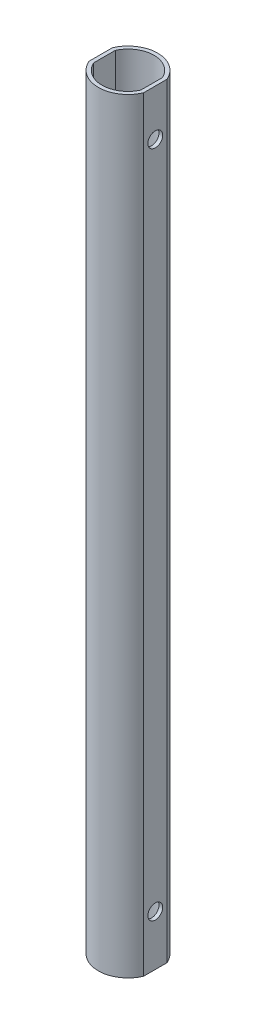
ISO-10303-21;
HEADER;
FILE_DESCRIPTION(('STEP AP214'),'2;1');
FILE_NAME('part.step','',(''),(''),'','','');
FILE_SCHEMA(('AUTOMOTIVE_DESIGN { 1 0 10303 214 1 1 1 1 }'));
ENDSEC;
DATA;
#1=APPLICATION_CONTEXT('core data for automotive mechanical design processes');
#2=APPLICATION_PROTOCOL_DEFINITION('international standard','automotive_design',2000,#1);
#3=PRODUCT_CONTEXT('',#1,'mechanical');
#4=PRODUCT('Part','Part','',(#3));
#5=PRODUCT_RELATED_PRODUCT_CATEGORY('part','',(#4));
#6=PRODUCT_DEFINITION_FORMATION('','',#4);
#7=PRODUCT_DEFINITION_CONTEXT('part definition',#1,'design');
#8=PRODUCT_DEFINITION('design','',#6,#7);
#9=PRODUCT_DEFINITION_SHAPE('','',#8);
#10=(LENGTH_UNIT() NAMED_UNIT(*) SI_UNIT(.MILLI.,.METRE.));
#11=(NAMED_UNIT(*) PLANE_ANGLE_UNIT() SI_UNIT($,.RADIAN.));
#12=(NAMED_UNIT(*) SI_UNIT($,.STERADIAN.) SOLID_ANGLE_UNIT());
#13=UNCERTAINTY_MEASURE_WITH_UNIT(LENGTH_MEASURE(1.E-05),#10,'distance_accuracy_value','');
#14=(GEOMETRIC_REPRESENTATION_CONTEXT(3) GLOBAL_UNCERTAINTY_ASSIGNED_CONTEXT((#13)) GLOBAL_UNIT_ASSIGNED_CONTEXT((#10,
#11,#12)) REPRESENTATION_CONTEXT('',''));
#15=CARTESIAN_POINT('',(0.,0.,0.));
#16=DIRECTION('',(0.,0.,1.));
#17=DIRECTION('',(1.,0.,0.));
#18=AXIS2_PLACEMENT_3D('',#15,#16,#17);
#19=CARTESIAN_POINT('',(0.,327.29,0.));
#20=DIRECTION('',(0.,1.,0.));
#21=DIRECTION('',(0.,0.,1.));
#22=AXIS2_PLACEMENT_3D('',#19,#20,#21);
#23=PLANE('',#22);
#24=CARTESIAN_POINT('',(0.,327.29,0.));
#25=DIRECTION('',(0.,1.,0.));
#26=DIRECTION('',(0.,0.,1.));
#27=AXIS2_PLACEMENT_3D('',#24,#25,#26);
#28=CIRCLE('',#27,12.7);
#29=CARTESIAN_POINT('',(-11.6743308159397,327.29,5.));
#30=VERTEX_POINT('',#29);
#31=CARTESIAN_POINT('',(11.6743308159397,327.29,5.));
#32=VERTEX_POINT('',#31);
#33=EDGE_CURVE('E142',#30,#32,#28,.T.);
#34=ORIENTED_EDGE('',*,*,#33,.T.);
#35=DIRECTION('',(0.,0.,-1.));
#36=VECTOR('',#35,1.);
#37=CARTESIAN_POINT('',(11.6743308159397,327.29,5.));
#38=LINE('',#37,#36);
#39=CARTESIAN_POINT('',(11.6743308159397,327.29,-5.));
#40=VERTEX_POINT('',#39);
#41=EDGE_CURVE('E145',#32,#40,#38,.T.);
#42=ORIENTED_EDGE('',*,*,#41,.T.);
#43=CARTESIAN_POINT('',(0.,327.29,0.));
#44=DIRECTION('',(0.,1.,0.));
#45=DIRECTION('',(0.,0.,1.));
#46=AXIS2_PLACEMENT_3D('',#43,#44,#45);
#47=CIRCLE('',#46,12.7);
#48=CARTESIAN_POINT('',(-11.6743308159397,327.29,-5.));
#49=VERTEX_POINT('',#48);
#50=EDGE_CURVE('E148',#40,#49,#47,.T.);
#51=ORIENTED_EDGE('',*,*,#50,.T.);
#52=DIRECTION('',(0.,0.,1.));
#53=VECTOR('',#52,1.);
#54=CARTESIAN_POINT('',(-11.6743308159397,327.29,-5.));
#55=LINE('',#54,#53);
#56=EDGE_CURVE('E150',#49,#30,#55,.T.);
#57=ORIENTED_EDGE('',*,*,#56,.T.);
#58=EDGE_LOOP('',(#34,#42,#51,#57));
#59=FACE_BOUND('',#58,.T.);
#60=DIRECTION('',(0.,0.,1.));
#61=VECTOR('',#60,1.);
#62=CARTESIAN_POINT('',(-10.0868308159397,327.29,-4.66299263784628));
#63=LINE('',#62,#61);
#64=CARTESIAN_POINT('',(-10.0868308159397,327.29,-4.66299263784628));
#65=VERTEX_POINT('',#64);
#66=CARTESIAN_POINT('',(-10.0868308159397,327.29,4.66299263784628));
#67=VERTEX_POINT('',#66);
#68=EDGE_CURVE('E112',#65,#67,#63,.T.);
#69=ORIENTED_EDGE('',*,*,#68,.F.);
#70=CARTESIAN_POINT('',(0.,327.29,0.));
#71=DIRECTION('',(0.,1.,0.));
#72=DIRECTION('',(0.,0.,1.));
#73=AXIS2_PLACEMENT_3D('',#70,#71,#72);
#74=CIRCLE('',#73,11.1125);
#75=CARTESIAN_POINT('',(10.0868308159397,327.29,-4.66299263784628));
#76=VERTEX_POINT('',#75);
#77=EDGE_CURVE('E104',#76,#65,#74,.T.);
#78=ORIENTED_EDGE('',*,*,#77,.F.);
#79=DIRECTION('',(0.,0.,-1.));
#80=VECTOR('',#79,1.);
#81=CARTESIAN_POINT('',(10.0868308159397,327.29,-4.66299263784628));
#82=LINE('',#81,#80);
#83=CARTESIAN_POINT('',(10.0868308159397,327.29,4.66299263784628));
#84=VERTEX_POINT('',#83);
#85=EDGE_CURVE('E126',#84,#76,#82,.T.);
#86=ORIENTED_EDGE('',*,*,#85,.F.);
#87=CARTESIAN_POINT('',(0.,327.29,0.));
#88=DIRECTION('',(0.,1.,0.));
#89=DIRECTION('',(0.,0.,1.));
#90=AXIS2_PLACEMENT_3D('',#87,#88,#89);
#91=CIRCLE('',#90,11.1125);
#92=EDGE_CURVE('E124',#67,#84,#91,.T.);
#93=ORIENTED_EDGE('',*,*,#92,.F.);
#94=EDGE_LOOP('',(#69,#78,#86,#93));
#95=FACE_BOUND('',#94,.T.);
#96=ADVANCED_FACE('F37',(#59,#95),#23,.T.);
#97=CARTESIAN_POINT('',(0.,0.,0.));
#98=DIRECTION('',(0.,1.,0.));
#99=DIRECTION('',(0.,0.,1.));
#100=AXIS2_PLACEMENT_3D('',#97,#98,#99);
#101=PLANE('',#100);
#102=CARTESIAN_POINT('',(0.,0.,0.));
#103=DIRECTION('',(0.,1.,0.));
#104=DIRECTION('',(0.,0.,1.));
#105=AXIS2_PLACEMENT_3D('',#102,#103,#104);
#106=CIRCLE('',#105,12.7);
#107=CARTESIAN_POINT('',(-11.6743308159397,0.,5.));
#108=VERTEX_POINT('',#107);
#109=CARTESIAN_POINT('',(11.6743308159397,0.,5.));
#110=VERTEX_POINT('',#109);
#111=EDGE_CURVE('E120',#108,#110,#106,.T.);
#112=ORIENTED_EDGE('',*,*,#111,.F.);
#113=DIRECTION('',(0.,0.,1.));
#114=VECTOR('',#113,1.);
#115=CARTESIAN_POINT('',(-11.6743308159397,0.,-5.));
#116=LINE('',#115,#114);
#117=CARTESIAN_POINT('',(-11.6743308159397,0.,-5.));
#118=VERTEX_POINT('',#117);
#119=EDGE_CURVE('E146',#118,#108,#116,.T.);
#120=ORIENTED_EDGE('',*,*,#119,.F.);
#121=CARTESIAN_POINT('',(0.,0.,0.));
#122=DIRECTION('',(0.,1.,0.));
#123=DIRECTION('',(0.,0.,1.));
#124=AXIS2_PLACEMENT_3D('',#121,#122,#123);
#125=CIRCLE('',#124,12.7);
#126=CARTESIAN_POINT('',(11.6743308159397,0.,-5.));
#127=VERTEX_POINT('',#126);
#128=EDGE_CURVE('E157',#127,#118,#125,.T.);
#129=ORIENTED_EDGE('',*,*,#128,.F.);
#130=DIRECTION('',(0.,0.,-1.));
#131=VECTOR('',#130,1.);
#132=CARTESIAN_POINT('',(11.6743308159397,0.,5.));
#133=LINE('',#132,#131);
#134=EDGE_CURVE('E155',#110,#127,#133,.T.);
#135=ORIENTED_EDGE('',*,*,#134,.F.);
#136=EDGE_LOOP('',(#112,#120,#129,#135));
#137=FACE_BOUND('',#136,.T.);
#138=CARTESIAN_POINT('',(0.,0.,0.));
#139=DIRECTION('',(0.,1.,0.));
#140=DIRECTION('',(0.,0.,1.));
#141=AXIS2_PLACEMENT_3D('',#138,#139,#140);
#142=CIRCLE('',#141,11.1125);
#143=CARTESIAN_POINT('',(10.0868308159397,0.,-4.66299263784628));
#144=VERTEX_POINT('',#143);
#145=CARTESIAN_POINT('',(-10.0868308159397,0.,-4.66299263784628));
#146=VERTEX_POINT('',#145);
#147=EDGE_CURVE('E62',#144,#146,#142,.T.);
#148=ORIENTED_EDGE('',*,*,#147,.T.);
#149=DIRECTION('',(0.,0.,1.));
#150=VECTOR('',#149,1.);
#151=CARTESIAN_POINT('',(-10.0868308159397,0.,-4.66299263784628));
#152=LINE('',#151,#150);
#153=CARTESIAN_POINT('',(-10.0868308159397,0.,4.66299263784628));
#154=VERTEX_POINT('',#153);
#155=EDGE_CURVE('E119',#146,#154,#152,.T.);
#156=ORIENTED_EDGE('',*,*,#155,.T.);
#157=CARTESIAN_POINT('',(0.,0.,0.));
#158=DIRECTION('',(0.,1.,0.));
#159=DIRECTION('',(0.,0.,1.));
#160=AXIS2_PLACEMENT_3D('',#157,#158,#159);
#161=CIRCLE('',#160,11.1125);
#162=CARTESIAN_POINT('',(10.0868308159397,0.,4.66299263784628));
#163=VERTEX_POINT('',#162);
#164=EDGE_CURVE('E134',#154,#163,#161,.T.);
#165=ORIENTED_EDGE('',*,*,#164,.T.);
#166=DIRECTION('',(0.,0.,-1.));
#167=VECTOR('',#166,1.);
#168=CARTESIAN_POINT('',(10.0868308159397,0.,-4.66299263784628));
#169=LINE('',#168,#167);
#170=EDGE_CURVE('E113',#163,#144,#169,.T.);
#171=ORIENTED_EDGE('',*,*,#170,.T.);
#172=EDGE_LOOP('',(#148,#156,#165,#171));
#173=FACE_BOUND('',#172,.T.);
#174=ADVANCED_FACE('F204',(#137,#173),#101,.F.);
#175=CARTESIAN_POINT('',(0.,327.29,0.));
#176=DIRECTION('',(0.,-1.,0.));
#177=DIRECTION('',(0.,0.,-1.));
#178=AXIS2_PLACEMENT_3D('',#175,#176,#177);
#179=CYLINDRICAL_SURFACE('',#178,12.7);
#180=ORIENTED_EDGE('',*,*,#111,.T.);
#181=DIRECTION('',(0.,-1.,0.));
#182=VECTOR('',#181,1.);
#183=CARTESIAN_POINT('',(11.6743308159397,327.29,5.));
#184=LINE('',#183,#182);
#185=EDGE_CURVE('E11',#32,#110,#184,.T.);
#186=ORIENTED_EDGE('',*,*,#185,.F.);
#187=ORIENTED_EDGE('',*,*,#33,.F.);
#188=DIRECTION('',(0.,-1.,0.));
#189=VECTOR('',#188,1.);
#190=CARTESIAN_POINT('',(-11.6743308159397,327.29,5.));
#191=LINE('',#190,#189);
#192=EDGE_CURVE('E152',#30,#108,#191,.T.);
#193=ORIENTED_EDGE('',*,*,#192,.T.);
#194=EDGE_LOOP('',(#180,#186,#187,#193));
#195=FACE_BOUND('',#194,.T.);
#196=ADVANCED_FACE('F39',(#195),#179,.T.);
#197=CARTESIAN_POINT('',(11.6743308159397,327.29,5.));
#198=DIRECTION('',(-1.,0.,0.));
#199=DIRECTION('',(0.,0.,1.));
#200=AXIS2_PLACEMENT_3D('',#197,#198,#199);
#201=PLANE('',#200);
#202=CARTESIAN_POINT('',(11.6743308159397,21.5,0.));
#203=DIRECTION('',(1.,0.,0.));
#204=DIRECTION('',(0.,0.,-1.));
#205=AXIS2_PLACEMENT_3D('',#202,#203,#204);
#206=CIRCLE('',#205,3.175);
#207=CARTESIAN_POINT('',(11.6743308159397,21.5,-3.175));
#208=VERTEX_POINT('',#207);
#209=EDGE_CURVE('E175',#208,#208,#206,.T.);
#210=ORIENTED_EDGE('',*,*,#209,.F.);
#211=EDGE_LOOP('',(#210));
#212=FACE_BOUND('',#211,.T.);
#213=CARTESIAN_POINT('',(11.6743308159397,307.54,0.));
#214=DIRECTION('',(1.,0.,0.));
#215=DIRECTION('',(0.,0.,-1.));
#216=AXIS2_PLACEMENT_3D('',#213,#214,#215);
#217=CIRCLE('',#216,3.175);
#218=CARTESIAN_POINT('',(11.6743308159397,307.54,-3.175));
#219=VERTEX_POINT('',#218);
#220=EDGE_CURVE('E180',#219,#219,#217,.T.);
#221=ORIENTED_EDGE('',*,*,#220,.F.);
#222=EDGE_LOOP('',(#221));
#223=FACE_BOUND('',#222,.T.);
#224=ORIENTED_EDGE('',*,*,#134,.T.);
#225=DIRECTION('',(0.,-1.,0.));
#226=VECTOR('',#225,1.);
#227=CARTESIAN_POINT('',(11.6743308159397,327.29,-5.));
#228=LINE('',#227,#226);
#229=EDGE_CURVE('E46',#40,#127,#228,.T.);
#230=ORIENTED_EDGE('',*,*,#229,.F.);
#231=ORIENTED_EDGE('',*,*,#41,.F.);
#232=ORIENTED_EDGE('',*,*,#185,.T.);
#233=EDGE_LOOP('',(#224,#230,#231,#232));
#234=FACE_BOUND('',#233,.T.);
#235=ADVANCED_FACE('F229',(#212,#223,#234),#201,.F.);
#236=CARTESIAN_POINT('',(0.,327.29,0.));
#237=DIRECTION('',(0.,-1.,0.));
#238=DIRECTION('',(0.,0.,-1.));
#239=AXIS2_PLACEMENT_3D('',#236,#237,#238);
#240=CYLINDRICAL_SURFACE('',#239,12.7);
#241=ORIENTED_EDGE('',*,*,#128,.T.);
#242=DIRECTION('',(0.,-1.,0.));
#243=VECTOR('',#242,1.);
#244=CARTESIAN_POINT('',(-11.6743308159397,327.29,-5.));
#245=LINE('',#244,#243);
#246=EDGE_CURVE('E162',#49,#118,#245,.T.);
#247=ORIENTED_EDGE('',*,*,#246,.F.);
#248=ORIENTED_EDGE('',*,*,#50,.F.);
#249=ORIENTED_EDGE('',*,*,#229,.T.);
#250=EDGE_LOOP('',(#241,#247,#248,#249));
#251=FACE_BOUND('',#250,.T.);
#252=ADVANCED_FACE('F226',(#251),#240,.T.);
#253=CARTESIAN_POINT('',(-11.6743308159397,327.29,-5.));
#254=DIRECTION('',(1.,0.,0.));
#255=DIRECTION('',(0.,0.,-1.));
#256=AXIS2_PLACEMENT_3D('',#253,#254,#255);
#257=PLANE('',#256);
#258=CARTESIAN_POINT('',(-11.6743308159397,21.5,0.));
#259=DIRECTION('',(1.,0.,0.));
#260=DIRECTION('',(0.,0.,-1.));
#261=AXIS2_PLACEMENT_3D('',#258,#259,#260);
#262=CIRCLE('',#261,3.175);
#263=CARTESIAN_POINT('',(-11.6743308159397,21.5,-3.175));
#264=VERTEX_POINT('',#263);
#265=EDGE_CURVE('E169',#264,#264,#262,.F.);
#266=ORIENTED_EDGE('',*,*,#265,.F.);
#267=EDGE_LOOP('',(#266));
#268=FACE_BOUND('',#267,.T.);
#269=CARTESIAN_POINT('',(-11.6743308159397,307.54,0.));
#270=DIRECTION('',(1.,0.,0.));
#271=DIRECTION('',(0.,0.,-1.));
#272=AXIS2_PLACEMENT_3D('',#269,#270,#271);
#273=CIRCLE('',#272,3.175);
#274=CARTESIAN_POINT('',(-11.6743308159397,307.54,-3.175));
#275=VERTEX_POINT('',#274);
#276=EDGE_CURVE('E183',#275,#275,#273,.F.);
#277=ORIENTED_EDGE('',*,*,#276,.F.);
#278=EDGE_LOOP('',(#277));
#279=FACE_BOUND('',#278,.T.);
#280=ORIENTED_EDGE('',*,*,#119,.T.);
#281=ORIENTED_EDGE('',*,*,#192,.F.);
#282=ORIENTED_EDGE('',*,*,#56,.F.);
#283=ORIENTED_EDGE('',*,*,#246,.T.);
#284=EDGE_LOOP('',(#280,#281,#282,#283));
#285=FACE_BOUND('',#284,.T.);
#286=ADVANCED_FACE('F223',(#268,#279,#285),#257,.F.);
#287=CARTESIAN_POINT('',(0.,327.29,0.));
#288=DIRECTION('',(0.,-1.,0.));
#289=DIRECTION('',(0.,0.,-1.));
#290=AXIS2_PLACEMENT_3D('',#287,#288,#289);
#291=CYLINDRICAL_SURFACE('',#290,11.1125);
#292=ORIENTED_EDGE('',*,*,#147,.F.);
#293=DIRECTION('',(0.,-1.,0.));
#294=VECTOR('',#293,1.);
#295=CARTESIAN_POINT('',(10.0868308159397,327.29,-4.66299263784628));
#296=LINE('',#295,#294);
#297=EDGE_CURVE('E108',#76,#144,#296,.T.);
#298=ORIENTED_EDGE('',*,*,#297,.F.);
#299=ORIENTED_EDGE('',*,*,#77,.T.);
#300=DIRECTION('',(0.,-1.,0.));
#301=VECTOR('',#300,1.);
#302=CARTESIAN_POINT('',(-10.0868308159397,327.29,-4.66299263784628));
#303=LINE('',#302,#301);
#304=EDGE_CURVE('E107',#65,#146,#303,.T.);
#305=ORIENTED_EDGE('',*,*,#304,.T.);
#306=EDGE_LOOP('',(#292,#298,#299,#305));
#307=FACE_BOUND('',#306,.T.);
#308=ADVANCED_FACE('F106',(#307),#291,.F.);
#309=CARTESIAN_POINT('',(-10.0868308159397,327.29,-4.66299263784628));
#310=DIRECTION('',(1.,0.,0.));
#311=DIRECTION('',(0.,0.,-1.));
#312=AXIS2_PLACEMENT_3D('',#309,#310,#311);
#313=PLANE('',#312);
#314=CARTESIAN_POINT('',(-10.0868308159397,21.5,0.));
#315=DIRECTION('',(1.,0.,0.));
#316=DIRECTION('',(0.,0.,-1.));
#317=AXIS2_PLACEMENT_3D('',#314,#315,#316);
#318=CIRCLE('',#317,3.175);
#319=CARTESIAN_POINT('',(-10.0868308159397,21.5,-3.175));
#320=VERTEX_POINT('',#319);
#321=EDGE_CURVE('E132',#320,#320,#318,.T.);
#322=ORIENTED_EDGE('',*,*,#321,.F.);
#323=EDGE_LOOP('',(#322));
#324=FACE_BOUND('',#323,.T.);
#325=CARTESIAN_POINT('',(-10.0868308159397,307.54,0.));
#326=DIRECTION('',(1.,0.,0.));
#327=DIRECTION('',(0.,0.,-1.));
#328=AXIS2_PLACEMENT_3D('',#325,#326,#327);
#329=CIRCLE('',#328,3.175);
#330=CARTESIAN_POINT('',(-10.0868308159397,307.54,-3.175));
#331=VERTEX_POINT('',#330);
#332=EDGE_CURVE('E168',#331,#331,#329,.T.);
#333=ORIENTED_EDGE('',*,*,#332,.F.);
#334=EDGE_LOOP('',(#333));
#335=FACE_BOUND('',#334,.T.);
#336=ORIENTED_EDGE('',*,*,#155,.F.);
#337=ORIENTED_EDGE('',*,*,#304,.F.);
#338=ORIENTED_EDGE('',*,*,#68,.T.);
#339=DIRECTION('',(0.,-1.,0.));
#340=VECTOR('',#339,1.);
#341=CARTESIAN_POINT('',(-10.0868308159397,327.29,4.66299263784628));
#342=LINE('',#341,#340);
#343=EDGE_CURVE('E121',#67,#154,#342,.T.);
#344=ORIENTED_EDGE('',*,*,#343,.T.);
#345=EDGE_LOOP('',(#336,#337,#338,#344));
#346=FACE_BOUND('',#345,.T.);
#347=ADVANCED_FACE('F116',(#324,#335,#346),#313,.T.);
#348=CARTESIAN_POINT('',(0.,327.29,0.));
#349=DIRECTION('',(0.,-1.,0.));
#350=DIRECTION('',(0.,0.,-1.));
#351=AXIS2_PLACEMENT_3D('',#348,#349,#350);
#352=CYLINDRICAL_SURFACE('',#351,11.1125);
#353=ORIENTED_EDGE('',*,*,#164,.F.);
#354=ORIENTED_EDGE('',*,*,#343,.F.);
#355=ORIENTED_EDGE('',*,*,#92,.T.);
#356=DIRECTION('',(0.,-1.,0.));
#357=VECTOR('',#356,1.);
#358=CARTESIAN_POINT('',(10.0868308159397,327.29,4.66299263784628));
#359=LINE('',#358,#357);
#360=EDGE_CURVE('E54',#84,#163,#359,.T.);
#361=ORIENTED_EDGE('',*,*,#360,.T.);
#362=EDGE_LOOP('',(#353,#354,#355,#361));
#363=FACE_BOUND('',#362,.T.);
#364=ADVANCED_FACE('F200',(#363),#352,.F.);
#365=CARTESIAN_POINT('',(10.0868308159397,327.29,-4.66299263784628));
#366=DIRECTION('',(-1.,0.,0.));
#367=DIRECTION('',(0.,0.,1.));
#368=AXIS2_PLACEMENT_3D('',#365,#366,#367);
#369=PLANE('',#368);
#370=CARTESIAN_POINT('',(10.0868308159397,21.5,0.));
#371=DIRECTION('',(-1.,0.,0.));
#372=DIRECTION('',(0.,0.,1.));
#373=AXIS2_PLACEMENT_3D('',#370,#371,#372);
#374=CIRCLE('',#373,3.175);
#375=CARTESIAN_POINT('',(10.0868308159397,21.5,3.175));
#376=VERTEX_POINT('',#375);
#377=EDGE_CURVE('E41',#376,#376,#374,.T.);
#378=ORIENTED_EDGE('',*,*,#377,.F.);
#379=EDGE_LOOP('',(#378));
#380=FACE_BOUND('',#379,.T.);
#381=CARTESIAN_POINT('',(10.0868308159397,307.54,0.));
#382=DIRECTION('',(-1.,0.,0.));
#383=DIRECTION('',(0.,0.,1.));
#384=AXIS2_PLACEMENT_3D('',#381,#382,#383);
#385=CIRCLE('',#384,3.175);
#386=CARTESIAN_POINT('',(10.0868308159397,307.54,3.175));
#387=VERTEX_POINT('',#386);
#388=EDGE_CURVE('E166',#387,#387,#385,.T.);
#389=ORIENTED_EDGE('',*,*,#388,.F.);
#390=EDGE_LOOP('',(#389));
#391=FACE_BOUND('',#390,.T.);
#392=ORIENTED_EDGE('',*,*,#170,.F.);
#393=ORIENTED_EDGE('',*,*,#360,.F.);
#394=ORIENTED_EDGE('',*,*,#85,.T.);
#395=ORIENTED_EDGE('',*,*,#297,.T.);
#396=EDGE_LOOP('',(#392,#393,#394,#395));
#397=FACE_BOUND('',#396,.T.);
#398=ADVANCED_FACE('F196',(#380,#391,#397),#369,.T.);
#399=CARTESIAN_POINT('',(-20.6545869370089,307.54,0.));
#400=DIRECTION('',(1.,0.,0.));
#401=DIRECTION('',(0.,0.,-1.));
#402=AXIS2_PLACEMENT_3D('',#399,#400,#401);
#403=CYLINDRICAL_SURFACE('',#402,3.175);
#404=ORIENTED_EDGE('',*,*,#388,.T.);
#405=EDGE_LOOP('',(#404));
#406=FACE_BOUND('',#405,.T.);
#407=ORIENTED_EDGE('',*,*,#220,.T.);
#408=EDGE_LOOP('',(#407));
#409=FACE_BOUND('',#408,.T.);
#410=ADVANCED_FACE('F199',(#406,#409),#403,.F.);
#411=CARTESIAN_POINT('',(-20.6545869370089,21.5,0.));
#412=DIRECTION('',(1.,0.,0.));
#413=DIRECTION('',(0.,0.,-1.));
#414=AXIS2_PLACEMENT_3D('',#411,#412,#413);
#415=CYLINDRICAL_SURFACE('',#414,3.175);
#416=ORIENTED_EDGE('',*,*,#377,.T.);
#417=EDGE_LOOP('',(#416));
#418=FACE_BOUND('',#417,.T.);
#419=ORIENTED_EDGE('',*,*,#209,.T.);
#420=EDGE_LOOP('',(#419));
#421=FACE_BOUND('',#420,.T.);
#422=ADVANCED_FACE('F193',(#418,#421),#415,.F.);
#423=ORIENTED_EDGE('',*,*,#332,.T.);
#424=EDGE_LOOP('',(#423));
#425=FACE_BOUND('',#424,.T.);
#426=ORIENTED_EDGE('',*,*,#276,.T.);
#427=EDGE_LOOP('',(#426));
#428=FACE_BOUND('',#427,.T.);
#429=ADVANCED_FACE('F255',(#425,#428),#403,.F.);
#430=ORIENTED_EDGE('',*,*,#321,.T.);
#431=EDGE_LOOP('',(#430));
#432=FACE_BOUND('',#431,.T.);
#433=ORIENTED_EDGE('',*,*,#265,.T.);
#434=EDGE_LOOP('',(#433));
#435=FACE_BOUND('',#434,.T.);
#436=ADVANCED_FACE('F260',(#432,#435),#415,.F.);
#437=CLOSED_SHELL('',(#96,#174,#196,#235,#252,#286,#308,#347,#364,#398,#410,#422,#429,#436));
#438=MANIFOLD_SOLID_BREP('B2',#437);
#439=ADVANCED_BREP_SHAPE_REPRESENTATION('',(#18,#438),#14);
#440=SHAPE_DEFINITION_REPRESENTATION(#9,#439);
ENDSEC;
END-ISO-10303-21;
